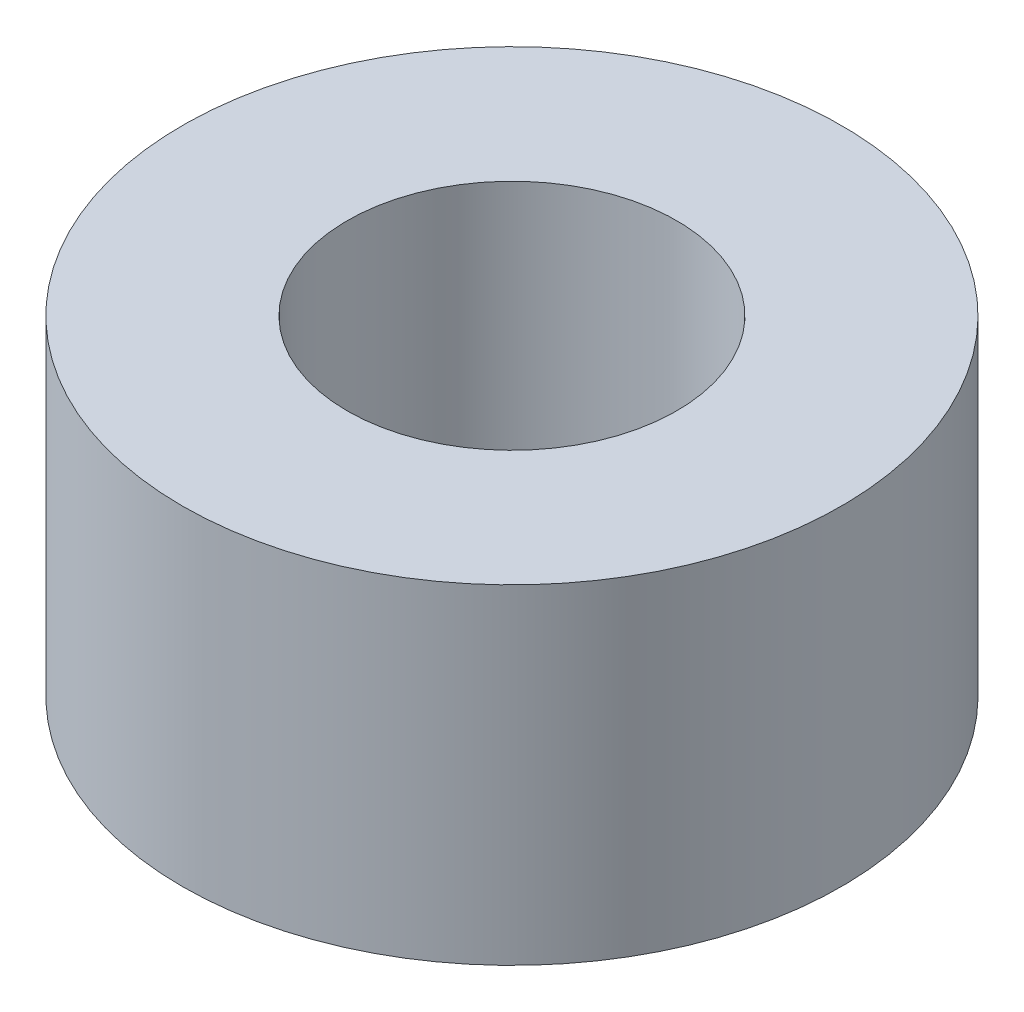
ISO-10303-21;
HEADER;
FILE_DESCRIPTION(('STEP AP214'),'2;1');
FILE_NAME('part.step','',(''),(''),'','','');
FILE_SCHEMA(('AUTOMOTIVE_DESIGN { 1 0 10303 214 1 1 1 1 }'));
ENDSEC;
DATA;
#1=APPLICATION_CONTEXT('core data for automotive mechanical design processes');
#2=APPLICATION_PROTOCOL_DEFINITION('international standard','automotive_design',2000,#1);
#3=PRODUCT_CONTEXT('',#1,'mechanical');
#4=PRODUCT('Part','Part','',(#3));
#5=PRODUCT_RELATED_PRODUCT_CATEGORY('part','',(#4));
#6=PRODUCT_DEFINITION_FORMATION('','',#4);
#7=PRODUCT_DEFINITION_CONTEXT('part definition',#1,'design');
#8=PRODUCT_DEFINITION('design','',#6,#7);
#9=PRODUCT_DEFINITION_SHAPE('','',#8);
#10=(LENGTH_UNIT() NAMED_UNIT(*) SI_UNIT(.MILLI.,.METRE.));
#11=(NAMED_UNIT(*) PLANE_ANGLE_UNIT() SI_UNIT($,.RADIAN.));
#12=(NAMED_UNIT(*) SI_UNIT($,.STERADIAN.) SOLID_ANGLE_UNIT());
#13=UNCERTAINTY_MEASURE_WITH_UNIT(LENGTH_MEASURE(1.E-05),#10,'distance_accuracy_value','');
#14=(GEOMETRIC_REPRESENTATION_CONTEXT(3) GLOBAL_UNCERTAINTY_ASSIGNED_CONTEXT((#13)) GLOBAL_UNIT_ASSIGNED_CONTEXT((#10,
#11,#12)) REPRESENTATION_CONTEXT('',''));
#15=CARTESIAN_POINT('',(0.,0.,0.));
#16=DIRECTION('',(0.,0.,1.));
#17=DIRECTION('',(1.,0.,0.));
#18=AXIS2_PLACEMENT_3D('',#15,#16,#17);
#19=CARTESIAN_POINT('',(0.,6.35,0.));
#20=DIRECTION('',(0.,1.,0.));
#21=DIRECTION('',(0.,0.,1.));
#22=AXIS2_PLACEMENT_3D('',#19,#20,#21);
#23=PLANE('',#22);
#24=CARTESIAN_POINT('',(0.,6.35,0.));
#25=DIRECTION('',(0.,1.,0.));
#26=DIRECTION('',(0.,0.,1.));
#27=AXIS2_PLACEMENT_3D('',#24,#25,#26);
#28=CIRCLE('',#27,6.35);
#29=CARTESIAN_POINT('',(0.,6.35,6.35));
#30=VERTEX_POINT('',#29);
#31=EDGE_CURVE('E10',#30,#30,#28,.T.);
#32=ORIENTED_EDGE('',*,*,#31,.T.);
#33=EDGE_LOOP('',(#32));
#34=FACE_BOUND('',#33,.T.);
#35=CARTESIAN_POINT('',(0.,6.35,0.));
#36=DIRECTION('',(0.,1.,0.));
#37=DIRECTION('',(0.,0.,1.));
#38=AXIS2_PLACEMENT_3D('',#35,#36,#37);
#39=CIRCLE('',#38,3.175);
#40=CARTESIAN_POINT('',(0.,6.35,3.175));
#41=VERTEX_POINT('',#40);
#42=EDGE_CURVE('E43',#41,#41,#39,.T.);
#43=ORIENTED_EDGE('',*,*,#42,.F.);
#44=EDGE_LOOP('',(#43));
#45=FACE_BOUND('',#44,.T.);
#46=ADVANCED_FACE('F32',(#34,#45),#23,.T.);
#47=CARTESIAN_POINT('',(0.,0.,0.));
#48=DIRECTION('',(0.,1.,0.));
#49=DIRECTION('',(0.,0.,1.));
#50=AXIS2_PLACEMENT_3D('',#47,#48,#49);
#51=PLANE('',#50);
#52=CARTESIAN_POINT('',(0.,0.,0.));
#53=DIRECTION('',(0.,1.,0.));
#54=DIRECTION('',(0.,0.,1.));
#55=AXIS2_PLACEMENT_3D('',#52,#53,#54);
#56=CIRCLE('',#55,6.35);
#57=CARTESIAN_POINT('',(0.,0.,6.35));
#58=VERTEX_POINT('',#57);
#59=EDGE_CURVE('E36',#58,#58,#56,.T.);
#60=ORIENTED_EDGE('',*,*,#59,.F.);
#61=EDGE_LOOP('',(#60));
#62=FACE_BOUND('',#61,.T.);
#63=CARTESIAN_POINT('',(0.,0.,0.));
#64=DIRECTION('',(0.,1.,0.));
#65=DIRECTION('',(0.,0.,1.));
#66=AXIS2_PLACEMENT_3D('',#63,#64,#65);
#67=CIRCLE('',#66,3.175);
#68=CARTESIAN_POINT('',(0.,0.,3.175));
#69=VERTEX_POINT('',#68);
#70=EDGE_CURVE('E45',#69,#69,#67,.T.);
#71=ORIENTED_EDGE('',*,*,#70,.T.);
#72=EDGE_LOOP('',(#71));
#73=FACE_BOUND('',#72,.T.);
#74=ADVANCED_FACE('F55',(#62,#73),#51,.F.);
#75=CARTESIAN_POINT('',(0.,6.35,0.));
#76=DIRECTION('',(0.,-1.,0.));
#77=DIRECTION('',(0.,0.,-1.));
#78=AXIS2_PLACEMENT_3D('',#75,#76,#77);
#79=CYLINDRICAL_SURFACE('',#78,6.35);
#80=ORIENTED_EDGE('',*,*,#31,.F.);
#81=EDGE_LOOP('',(#80));
#82=FACE_BOUND('',#81,.T.);
#83=ORIENTED_EDGE('',*,*,#59,.T.);
#84=EDGE_LOOP('',(#83));
#85=FACE_BOUND('',#84,.T.);
#86=ADVANCED_FACE('F34',(#82,#85),#79,.T.);
#87=CARTESIAN_POINT('',(0.,6.35,0.));
#88=DIRECTION('',(0.,-1.,0.));
#89=DIRECTION('',(0.,0.,-1.));
#90=AXIS2_PLACEMENT_3D('',#87,#88,#89);
#91=CYLINDRICAL_SURFACE('',#90,3.175);
#92=ORIENTED_EDGE('',*,*,#42,.T.);
#93=EDGE_LOOP('',(#92));
#94=FACE_BOUND('',#93,.T.);
#95=ORIENTED_EDGE('',*,*,#70,.F.);
#96=EDGE_LOOP('',(#95));
#97=FACE_BOUND('',#96,.T.);
#98=ADVANCED_FACE('F51',(#94,#97),#91,.F.);
#99=CLOSED_SHELL('',(#46,#74,#86,#98));
#100=MANIFOLD_SOLID_BREP('B2',#99);
#101=ADVANCED_BREP_SHAPE_REPRESENTATION('',(#18,#100),#14);
#102=SHAPE_DEFINITION_REPRESENTATION(#9,#101);
ENDSEC;
END-ISO-10303-21;
